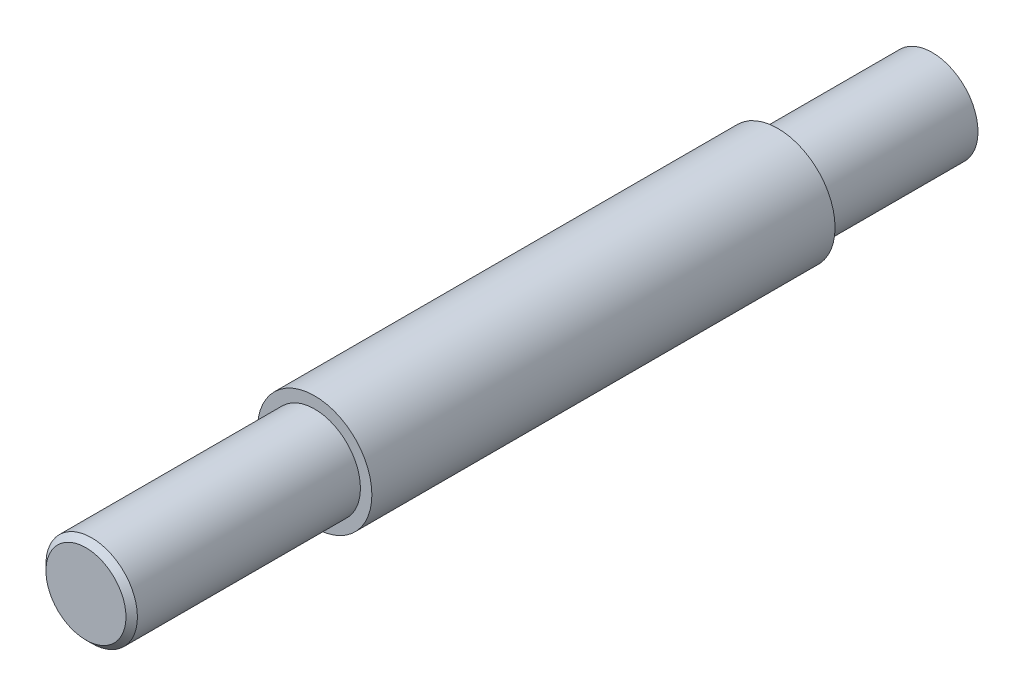
ISO-10303-21;
HEADER;
FILE_DESCRIPTION(('STEP AP214'),'2;1');
FILE_NAME('part.step','',(''),(''),'','','');
FILE_SCHEMA(('AUTOMOTIVE_DESIGN { 1 0 10303 214 1 1 1 1 }'));
ENDSEC;
DATA;
#1=APPLICATION_CONTEXT('core data for automotive mechanical design processes');
#2=APPLICATION_PROTOCOL_DEFINITION('international standard','automotive_design',2000,#1);
#3=PRODUCT_CONTEXT('',#1,'mechanical');
#4=PRODUCT('Part','Part','',(#3));
#5=PRODUCT_RELATED_PRODUCT_CATEGORY('part','',(#4));
#6=PRODUCT_DEFINITION_FORMATION('','',#4);
#7=PRODUCT_DEFINITION_CONTEXT('part definition',#1,'design');
#8=PRODUCT_DEFINITION('design','',#6,#7);
#9=PRODUCT_DEFINITION_SHAPE('','',#8);
#10=(LENGTH_UNIT() NAMED_UNIT(*) SI_UNIT(.MILLI.,.METRE.));
#11=(NAMED_UNIT(*) PLANE_ANGLE_UNIT() SI_UNIT($,.RADIAN.));
#12=(NAMED_UNIT(*) SI_UNIT($,.STERADIAN.) SOLID_ANGLE_UNIT());
#13=UNCERTAINTY_MEASURE_WITH_UNIT(LENGTH_MEASURE(1.E-05),#10,'distance_accuracy_value','');
#14=(GEOMETRIC_REPRESENTATION_CONTEXT(3) GLOBAL_UNCERTAINTY_ASSIGNED_CONTEXT((#13)) GLOBAL_UNIT_ASSIGNED_CONTEXT((#10,
#11,#12)) REPRESENTATION_CONTEXT('',''));
#15=CARTESIAN_POINT('',(0.,0.,0.));
#16=DIRECTION('',(0.,0.,1.));
#17=DIRECTION('',(1.,0.,0.));
#18=AXIS2_PLACEMENT_3D('',#15,#16,#17);
#19=CARTESIAN_POINT('',(0.,0.,108.));
#20=DIRECTION('',(0.,0.,1.));
#21=DIRECTION('',(1.,0.,0.));
#22=AXIS2_PLACEMENT_3D('',#19,#20,#21);
#23=PLANE('',#22);
#24=CARTESIAN_POINT('',(0.,0.,108.));
#25=DIRECTION('',(0.,0.,1.));
#26=DIRECTION('',(1.,0.,0.));
#27=AXIS2_PLACEMENT_3D('',#24,#25,#26);
#28=CIRCLE('',#27,10.);
#29=CARTESIAN_POINT('',(10.,0.,108.));
#30=VERTEX_POINT('',#29);
#31=EDGE_CURVE('E49',#30,#30,#28,.T.);
#32=ORIENTED_EDGE('',*,*,#31,.T.);
#33=EDGE_LOOP('',(#32));
#34=FACE_BOUND('',#33,.T.);
#35=CARTESIAN_POINT('',(0.,0.,108.));
#36=DIRECTION('',(0.,0.,1.));
#37=DIRECTION('',(1.,0.,0.));
#38=AXIS2_PLACEMENT_3D('',#35,#36,#37);
#39=CIRCLE('',#38,8.);
#40=CARTESIAN_POINT('',(8.,0.,108.));
#41=VERTEX_POINT('',#40);
#42=EDGE_CURVE('E54',#41,#41,#39,.T.);
#43=ORIENTED_EDGE('',*,*,#42,.F.);
#44=EDGE_LOOP('',(#43));
#45=FACE_BOUND('',#44,.T.);
#46=ADVANCED_FACE('F30',(#34,#45),#23,.T.);
#47=CARTESIAN_POINT('',(0.,0.,27.));
#48=DIRECTION('',(0.,0.,-1.));
#49=DIRECTION('',(-1.,0.,0.));
#50=AXIS2_PLACEMENT_3D('',#47,#48,#49);
#51=CYLINDRICAL_SURFACE('',#50,8.);
#52=CARTESIAN_POINT('',(0.,0.,27.));
#53=DIRECTION('',(0.,0.,1.));
#54=DIRECTION('',(1.,0.,0.));
#55=AXIS2_PLACEMENT_3D('',#52,#53,#54);
#56=CIRCLE('',#55,8.);
#57=CARTESIAN_POINT('',(8.,0.,27.));
#58=VERTEX_POINT('',#57);
#59=EDGE_CURVE('E41',#58,#58,#56,.T.);
#60=ORIENTED_EDGE('',*,*,#59,.F.);
#61=EDGE_LOOP('',(#60));
#62=FACE_BOUND('',#61,.T.);
#63=CARTESIAN_POINT('',(0.,0.,0.));
#64=DIRECTION('',(0.,0.,1.));
#65=DIRECTION('',(1.,0.,0.));
#66=AXIS2_PLACEMENT_3D('',#63,#64,#65);
#67=CIRCLE('',#66,8.);
#68=CARTESIAN_POINT('',(8.,0.,0.));
#69=VERTEX_POINT('',#68);
#70=EDGE_CURVE('E45',#69,#69,#67,.T.);
#71=ORIENTED_EDGE('',*,*,#70,.T.);
#72=EDGE_LOOP('',(#71));
#73=FACE_BOUND('',#72,.T.);
#74=ADVANCED_FACE('F78',(#62,#73),#51,.T.);
#75=CARTESIAN_POINT('',(0.,0.,0.));
#76=DIRECTION('',(0.,0.,1.));
#77=DIRECTION('',(1.,0.,0.));
#78=AXIS2_PLACEMENT_3D('',#75,#76,#77);
#79=PLANE('',#78);
#80=CARTESIAN_POINT('',(0.,0.,0.));
#81=DIRECTION('',(0.,0.,-1.));
#82=DIRECTION('',(-1.,0.,0.));
#83=AXIS2_PLACEMENT_3D('',#80,#81,#82);
#84=CIRCLE('',#83,4.);
#85=CARTESIAN_POINT('',(-4.,0.,0.));
#86=VERTEX_POINT('',#85);
#87=EDGE_CURVE('E60',#86,#86,#84,.T.);
#88=ORIENTED_EDGE('',*,*,#87,.F.);
#89=EDGE_LOOP('',(#88));
#90=FACE_BOUND('',#89,.T.);
#91=ORIENTED_EDGE('',*,*,#70,.F.);
#92=EDGE_LOOP('',(#91));
#93=FACE_BOUND('',#92,.T.);
#94=ADVANCED_FACE('F74',(#90,#93),#79,.F.);
#95=CARTESIAN_POINT('',(0.,0.,27.));
#96=DIRECTION('',(0.,0.,1.));
#97=DIRECTION('',(1.,0.,0.));
#98=AXIS2_PLACEMENT_3D('',#95,#96,#97);
#99=PLANE('',#98);
#100=CARTESIAN_POINT('',(0.,0.,27.));
#101=DIRECTION('',(0.,0.,1.));
#102=DIRECTION('',(1.,0.,0.));
#103=AXIS2_PLACEMENT_3D('',#100,#101,#102);
#104=CIRCLE('',#103,10.);
#105=CARTESIAN_POINT('',(10.,0.,27.));
#106=VERTEX_POINT('',#105);
#107=EDGE_CURVE('E51',#106,#106,#104,.T.);
#108=ORIENTED_EDGE('',*,*,#107,.F.);
#109=EDGE_LOOP('',(#108));
#110=FACE_BOUND('',#109,.T.);
#111=ORIENTED_EDGE('',*,*,#59,.T.);
#112=EDGE_LOOP('',(#111));
#113=FACE_BOUND('',#112,.T.);
#114=ADVANCED_FACE('F77',(#110,#113),#99,.F.);
#115=CARTESIAN_POINT('',(0.,0.,108.));
#116=DIRECTION('',(0.,0.,-1.));
#117=DIRECTION('',(-1.,0.,0.));
#118=AXIS2_PLACEMENT_3D('',#115,#116,#117);
#119=CYLINDRICAL_SURFACE('',#118,10.);
#120=ORIENTED_EDGE('',*,*,#31,.F.);
#121=EDGE_LOOP('',(#120));
#122=FACE_BOUND('',#121,.T.);
#123=ORIENTED_EDGE('',*,*,#107,.T.);
#124=EDGE_LOOP('',(#123));
#125=FACE_BOUND('',#124,.T.);
#126=ADVANCED_FACE('F91',(#122,#125),#119,.T.);
#127=CARTESIAN_POINT('',(0.,0.,148.));
#128=DIRECTION('',(0.,0.,-1.));
#129=DIRECTION('',(-1.,0.,0.));
#130=AXIS2_PLACEMENT_3D('',#127,#128,#129);
#131=CYLINDRICAL_SURFACE('',#130,8.);
#132=CARTESIAN_POINT('',(0.,0.,147.));
#133=DIRECTION('',(0.,0.,1.));
#134=DIRECTION('',(1.,0.,0.));
#135=AXIS2_PLACEMENT_3D('',#132,#133,#134);
#136=CIRCLE('',#135,8.);
#137=CARTESIAN_POINT('',(8.,0.,147.));
#138=VERTEX_POINT('',#137);
#139=EDGE_CURVE('E10',#138,#138,#136,.F.);
#140=ORIENTED_EDGE('',*,*,#139,.T.);
#141=EDGE_LOOP('',(#140));
#142=FACE_BOUND('',#141,.T.);
#143=ORIENTED_EDGE('',*,*,#42,.T.);
#144=EDGE_LOOP('',(#143));
#145=FACE_BOUND('',#144,.T.);
#146=ADVANCED_FACE('F94',(#142,#145),#131,.T.);
#147=CARTESIAN_POINT('',(0.,0.,148.));
#148=DIRECTION('',(0.,0.,1.));
#149=DIRECTION('',(1.,0.,0.));
#150=AXIS2_PLACEMENT_3D('',#147,#148,#149);
#151=PLANE('',#150);
#152=CARTESIAN_POINT('',(0.,0.,148.));
#153=DIRECTION('',(0.,0.,1.));
#154=DIRECTION('',(1.,0.,0.));
#155=AXIS2_PLACEMENT_3D('',#152,#153,#154);
#156=CIRCLE('',#155,7.00000000000002);
#157=CARTESIAN_POINT('',(7.00000000000002,0.,148.));
#158=VERTEX_POINT('',#157);
#159=EDGE_CURVE('E37',#158,#158,#156,.T.);
#160=ORIENTED_EDGE('',*,*,#159,.T.);
#161=EDGE_LOOP('',(#160));
#162=FACE_BOUND('',#161,.T.);
#163=ADVANCED_FACE('F101',(#162),#151,.T.);
#164=CARTESIAN_POINT('',(0.,0.,148.));
#165=DIRECTION('',(0.,0.,-1.));
#166=DIRECTION('',(-1.,0.,0.));
#167=AXIS2_PLACEMENT_3D('',#164,#165,#166);
#168=CONICAL_SURFACE('',#167,7.00000000000002,0.785398163397438);
#169=ORIENTED_EDGE('',*,*,#139,.F.);
#170=EDGE_LOOP('',(#169));
#171=FACE_BOUND('',#170,.T.);
#172=ORIENTED_EDGE('',*,*,#159,.F.);
#173=EDGE_LOOP('',(#172));
#174=FACE_BOUND('',#173,.T.);
#175=ADVANCED_FACE('F32',(#171,#174),#168,.T.);
#176=CARTESIAN_POINT('',(0.,0.,25.));
#177=DIRECTION('',(0.,0.,-1.));
#178=DIRECTION('',(-1.,0.,0.));
#179=AXIS2_PLACEMENT_3D('',#176,#177,#178);
#180=CYLINDRICAL_SURFACE('',#179,4.);
#181=CARTESIAN_POINT('',(0.,0.,25.));
#182=DIRECTION('',(0.,0.,-1.));
#183=DIRECTION('',(-1.,0.,0.));
#184=AXIS2_PLACEMENT_3D('',#181,#182,#183);
#185=CIRCLE('',#184,4.);
#186=CARTESIAN_POINT('',(-4.,0.,25.));
#187=VERTEX_POINT('',#186);
#188=EDGE_CURVE('E59',#187,#187,#185,.T.);
#189=ORIENTED_EDGE('',*,*,#188,.F.);
#190=EDGE_LOOP('',(#189));
#191=FACE_BOUND('',#190,.T.);
#192=ORIENTED_EDGE('',*,*,#87,.T.);
#193=EDGE_LOOP('',(#192));
#194=FACE_BOUND('',#193,.T.);
#195=ADVANCED_FACE('F68',(#191,#194),#180,.F.);
#196=CARTESIAN_POINT('',(0.,0.,25.));
#197=DIRECTION('',(0.,0.,-1.));
#198=DIRECTION('',(-1.,0.,0.));
#199=AXIS2_PLACEMENT_3D('',#196,#197,#198);
#200=PLANE('',#199);
#201=ORIENTED_EDGE('',*,*,#188,.T.);
#202=EDGE_LOOP('',(#201));
#203=FACE_BOUND('',#202,.T.);
#204=ADVANCED_FACE('F66',(#203),#200,.T.);
#205=CLOSED_SHELL('',(#46,#74,#94,#114,#126,#146,#163,#175,#195,#204));
#206=MANIFOLD_SOLID_BREP('B2',#205);
#207=ADVANCED_BREP_SHAPE_REPRESENTATION('',(#18,#206),#14);
#208=SHAPE_DEFINITION_REPRESENTATION(#9,#207);
ENDSEC;
END-ISO-10303-21;
